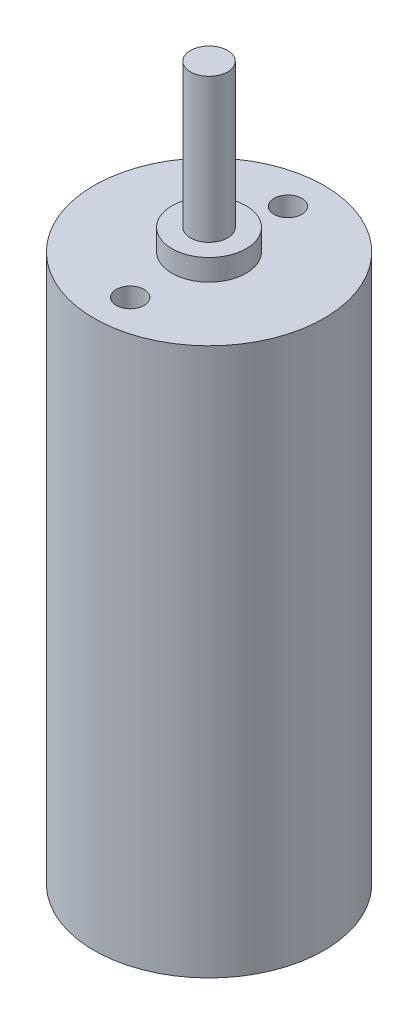
ISO-10303-21;
HEADER;
FILE_DESCRIPTION(('STEP AP214'),'2;1');
FILE_NAME('part.step','',(''),(''),'','','');
FILE_SCHEMA(('AUTOMOTIVE_DESIGN { 1 0 10303 214 1 1 1 1 }'));
ENDSEC;
DATA;
#1=APPLICATION_CONTEXT('core data for automotive mechanical design processes');
#2=APPLICATION_PROTOCOL_DEFINITION('international standard','automotive_design',2000,#1);
#3=PRODUCT_CONTEXT('',#1,'mechanical');
#4=PRODUCT('Part','Part','',(#3));
#5=PRODUCT_RELATED_PRODUCT_CATEGORY('part','',(#4));
#6=PRODUCT_DEFINITION_FORMATION('','',#4);
#7=PRODUCT_DEFINITION_CONTEXT('part definition',#1,'design');
#8=PRODUCT_DEFINITION('design','',#6,#7);
#9=PRODUCT_DEFINITION_SHAPE('','',#8);
#10=(LENGTH_UNIT() NAMED_UNIT(*) SI_UNIT(.MILLI.,.METRE.));
#11=(NAMED_UNIT(*) PLANE_ANGLE_UNIT() SI_UNIT($,.RADIAN.));
#12=(NAMED_UNIT(*) SI_UNIT($,.STERADIAN.) SOLID_ANGLE_UNIT());
#13=UNCERTAINTY_MEASURE_WITH_UNIT(LENGTH_MEASURE(1.E-05),#10,'distance_accuracy_value','');
#14=(GEOMETRIC_REPRESENTATION_CONTEXT(3) GLOBAL_UNCERTAINTY_ASSIGNED_CONTEXT((#13)) GLOBAL_UNIT_ASSIGNED_CONTEXT((#10,
#11,#12)) REPRESENTATION_CONTEXT('',''));
#15=CARTESIAN_POINT('',(0.,0.,0.));
#16=DIRECTION('',(0.,0.,1.));
#17=DIRECTION('',(1.,0.,0.));
#18=AXIS2_PLACEMENT_3D('',#15,#16,#17);
#19=CARTESIAN_POINT('',(0.,59.,0.));
#20=DIRECTION('',(0.,-1.,0.));
#21=DIRECTION('',(0.,0.,-1.));
#22=AXIS2_PLACEMENT_3D('',#19,#20,#21);
#23=CYLINDRICAL_SURFACE('',#22,12.4);
#24=CARTESIAN_POINT('',(0.,59.,0.));
#25=DIRECTION('',(0.,1.,0.));
#26=DIRECTION('',(0.,0.,1.));
#27=AXIS2_PLACEMENT_3D('',#24,#25,#26);
#28=CIRCLE('',#27,12.4);
#29=CARTESIAN_POINT('',(0.,59.,-12.4));
#30=VERTEX_POINT('',#29);
#31=EDGE_CURVE('E49',#30,#30,#28,.T.);
#32=CARTESIAN_POINT('',(0.,0.,0.));
#33=DIRECTION('',(0.,1.,0.));
#34=DIRECTION('',(0.,0.,1.));
#35=AXIS2_PLACEMENT_3D('',#32,#33,#34);
#36=CIRCLE('',#35,12.4);
#37=CARTESIAN_POINT('',(0.,0.,-12.4));
#38=VERTEX_POINT('',#37);
#39=EDGE_CURVE('E44',#38,#38,#36,.T.);
#40=CARTESIAN_POINT('',(0.,59.,-12.4));
#41=CARTESIAN_POINT('',(0.,58.3854166666667,-12.4));
#42=CARTESIAN_POINT('',(0.,57.7708333333333,-12.4));
#43=CARTESIAN_POINT('',(0.,56.5416666666667,-12.4));
#44=CARTESIAN_POINT('',(0.,55.9270833333333,-12.4));
#45=CARTESIAN_POINT('',(0.,54.6979166666667,-12.4));
#46=CARTESIAN_POINT('',(0.,54.0833333333333,-12.4));
#47=CARTESIAN_POINT('',(0.,52.8541666666667,-12.4));
#48=CARTESIAN_POINT('',(0.,52.2395833333333,-12.4));
#49=CARTESIAN_POINT('',(0.,51.0104166666667,-12.4));
#50=CARTESIAN_POINT('',(0.,50.3958333333333,-12.4));
#51=CARTESIAN_POINT('',(0.,49.1666666666667,-12.4));
#52=CARTESIAN_POINT('',(0.,48.5520833333333,-12.4));
#53=CARTESIAN_POINT('',(0.,47.3229166666667,-12.4));
#54=CARTESIAN_POINT('',(0.,46.7083333333333,-12.4));
#55=CARTESIAN_POINT('',(0.,45.4791666666667,-12.4));
#56=CARTESIAN_POINT('',(0.,44.8645833333333,-12.4));
#57=CARTESIAN_POINT('',(0.,43.6354166666667,-12.4));
#58=CARTESIAN_POINT('',(0.,43.0208333333333,-12.4));
#59=CARTESIAN_POINT('',(0.,41.7916666666667,-12.4));
#60=CARTESIAN_POINT('',(0.,41.1770833333333,-12.4));
#61=CARTESIAN_POINT('',(0.,39.9479166666667,-12.4));
#62=CARTESIAN_POINT('',(0.,39.3333333333333,-12.4));
#63=CARTESIAN_POINT('',(0.,38.1041666666667,-12.4));
#64=CARTESIAN_POINT('',(0.,37.4895833333333,-12.4));
#65=CARTESIAN_POINT('',(0.,36.2604166666667,-12.4));
#66=CARTESIAN_POINT('',(0.,35.6458333333333,-12.4));
#67=CARTESIAN_POINT('',(0.,34.4166666666667,-12.4));
#68=CARTESIAN_POINT('',(0.,33.8020833333333,-12.4));
#69=CARTESIAN_POINT('',(0.,32.5729166666667,-12.4));
#70=CARTESIAN_POINT('',(0.,31.9583333333333,-12.4));
#71=CARTESIAN_POINT('',(0.,30.7291666666667,-12.4));
#72=CARTESIAN_POINT('',(0.,30.1145833333333,-12.4));
#73=CARTESIAN_POINT('',(0.,28.8854166666667,-12.4));
#74=CARTESIAN_POINT('',(0.,28.2708333333333,-12.4));
#75=CARTESIAN_POINT('',(0.,27.0416666666667,-12.4));
#76=CARTESIAN_POINT('',(0.,26.4270833333333,-12.4));
#77=CARTESIAN_POINT('',(0.,25.1979166666667,-12.4));
#78=CARTESIAN_POINT('',(0.,24.5833333333333,-12.4));
#79=CARTESIAN_POINT('',(0.,23.3541666666667,-12.4));
#80=CARTESIAN_POINT('',(0.,22.7395833333333,-12.4));
#81=CARTESIAN_POINT('',(0.,21.5104166666667,-12.4));
#82=CARTESIAN_POINT('',(0.,20.8958333333333,-12.4));
#83=CARTESIAN_POINT('',(0.,19.6666666666667,-12.4));
#84=CARTESIAN_POINT('',(0.,19.0520833333333,-12.4));
#85=CARTESIAN_POINT('',(0.,17.8229166666667,-12.4));
#86=CARTESIAN_POINT('',(0.,17.2083333333333,-12.4));
#87=CARTESIAN_POINT('',(0.,15.9791666666667,-12.4));
#88=CARTESIAN_POINT('',(0.,15.3645833333333,-12.4));
#89=CARTESIAN_POINT('',(0.,14.1354166666667,-12.4));
#90=CARTESIAN_POINT('',(0.,13.5208333333333,-12.4));
#91=CARTESIAN_POINT('',(0.,12.2916666666667,-12.4));
#92=CARTESIAN_POINT('',(0.,11.6770833333333,-12.4));
#93=CARTESIAN_POINT('',(0.,10.4479166666667,-12.4));
#94=CARTESIAN_POINT('',(0.,9.83333333333333,-12.4));
#95=CARTESIAN_POINT('',(0.,8.60416666666666,-12.4));
#96=CARTESIAN_POINT('',(0.,7.98958333333333,-12.4));
#97=CARTESIAN_POINT('',(0.,6.76041666666667,-12.4));
#98=CARTESIAN_POINT('',(0.,6.14583333333333,-12.4));
#99=CARTESIAN_POINT('',(0.,4.91666666666667,-12.4));
#100=CARTESIAN_POINT('',(0.,4.30208333333334,-12.4));
#101=CARTESIAN_POINT('',(0.,3.07291666666667,-12.4));
#102=CARTESIAN_POINT('',(0.,2.45833333333333,-12.4));
#103=CARTESIAN_POINT('',(0.,1.22916666666667,-12.4));
#104=CARTESIAN_POINT('',(0.,0.614583333333332,-12.4));
#105=CARTESIAN_POINT('',(0.,0.,-12.4));
#106=B_SPLINE_CURVE_WITH_KNOTS('',3,(#40,#41,#42,#43,#44,#45,#46,#47,#48,#49,#50,#51,#52,#53,
#54,#55,#56,#57,#58,#59,#60,#61,#62,#63,#64,#65,#66,#67,#68,#69,#70,#71,#72,#73,#74,#75,#76,#77,
#78,#79,#80,#81,#82,#83,#84,#85,#86,#87,#88,#89,#90,#91,#92,#93,#94,#95,#96,#97,#98,#99,#100,
#101,#102,#103,#104,#105),.UNSPECIFIED.,.F.,.F.,(4,2,2,2,2,2,2,2,2,2,2,2,2,2,2,2,2,2,2,2,2,2,2,
2,2,2,2,2,2,2,2,2,4),(0.,1.84375,3.6875,5.53124999999999,7.37499999999999,9.21875,11.0625,
12.90625,14.75,16.59375,18.4375,20.28125,22.125,23.96875,25.8125,27.65625,29.5,31.34375,33.1875,
35.03125,36.875,38.71875,40.5625,42.40625,44.25,46.09375,47.9375,49.78125,51.625,53.46875,
55.3125,57.15625,59.),.UNSPECIFIED.);
#107=EDGE_CURVE('BSEAM41',#30,#38,#106,.T.);
#108=ORIENTED_EDGE('',*,*,#31,.F.);
#109=ORIENTED_EDGE('',*,*,#39,.T.);
#110=ORIENTED_EDGE('',*,*,#107,.T.);
#111=ORIENTED_EDGE('',*,*,#107,.F.);
#112=EDGE_LOOP('',(#108,#110,#109,#111));
#113=FACE_BOUND('',#112,.T.);
#114=ADVANCED_FACE('F41',(#113),#23,.T.);
#115=CARTESIAN_POINT('',(0.,59.,0.));
#116=DIRECTION('',(0.,1.,0.));
#117=DIRECTION('',(0.,0.,1.));
#118=AXIS2_PLACEMENT_3D('',#115,#116,#117);
#119=PLANE('',#118);
#120=CARTESIAN_POINT('',(0.,59.,0.));
#121=DIRECTION('',(0.,1.,0.));
#122=DIRECTION('',(0.,0.,1.));
#123=AXIS2_PLACEMENT_3D('',#120,#121,#122);
#124=CIRCLE('',#123,4.);
#125=CARTESIAN_POINT('',(0.,59.,4.));
#126=VERTEX_POINT('',#125);
#127=EDGE_CURVE('E63',#126,#126,#124,.T.);
#128=ORIENTED_EDGE('',*,*,#127,.F.);
#129=EDGE_LOOP('',(#128));
#130=FACE_BOUND('',#129,.T.);
#131=CARTESIAN_POINT('',(0.,59.,-8.5));
#132=DIRECTION('',(0.,1.,0.));
#133=DIRECTION('',(0.,0.,1.));
#134=AXIS2_PLACEMENT_3D('',#131,#132,#133);
#135=CIRCLE('',#134,1.5);
#136=CARTESIAN_POINT('',(0.,59.,-7.));
#137=VERTEX_POINT('',#136);
#138=EDGE_CURVE('E71',#137,#137,#135,.T.);
#139=ORIENTED_EDGE('',*,*,#138,.F.);
#140=EDGE_LOOP('',(#139));
#141=FACE_BOUND('',#140,.T.);
#142=CARTESIAN_POINT('',(0.,59.,8.5));
#143=DIRECTION('',(0.,1.,0.));
#144=DIRECTION('',(0.,0.,1.));
#145=AXIS2_PLACEMENT_3D('',#142,#143,#144);
#146=CIRCLE('',#145,1.5);
#147=CARTESIAN_POINT('',(0.,59.,10.));
#148=VERTEX_POINT('',#147);
#149=EDGE_CURVE('E75',#148,#148,#146,.T.);
#150=ORIENTED_EDGE('',*,*,#149,.F.);
#151=EDGE_LOOP('',(#150));
#152=FACE_BOUND('',#151,.T.);
#153=ORIENTED_EDGE('',*,*,#31,.T.);
#154=EDGE_LOOP('',(#153));
#155=FACE_BOUND('',#154,.T.);
#156=ADVANCED_FACE('F92',(#130,#141,#152,#155),#119,.T.);
#157=CARTESIAN_POINT('',(0.,0.,0.));
#158=DIRECTION('',(0.,1.,0.));
#159=DIRECTION('',(0.,0.,1.));
#160=AXIS2_PLACEMENT_3D('',#157,#158,#159);
#161=PLANE('',#160);
#162=ORIENTED_EDGE('',*,*,#39,.F.);
#163=EDGE_LOOP('',(#162));
#164=FACE_BOUND('',#163,.T.);
#165=ADVANCED_FACE('F88',(#164),#161,.F.);
#166=CARTESIAN_POINT('',(0.,55.5202,8.5));
#167=DIRECTION('',(0.,1.,0.));
#168=DIRECTION('',(0.,0.,1.));
#169=AXIS2_PLACEMENT_3D('',#166,#167,#168);
#170=CYLINDRICAL_SURFACE('',#169,1.5);
#171=CARTESIAN_POINT('',(0.,55.5202,8.5));
#172=DIRECTION('',(0.,1.,0.));
#173=DIRECTION('',(0.,0.,1.));
#174=AXIS2_PLACEMENT_3D('',#171,#172,#173);
#175=CIRCLE('',#174,1.5);
#176=CARTESIAN_POINT('',(0.,55.5202,10.));
#177=VERTEX_POINT('',#176);
#178=EDGE_CURVE('E62',#177,#177,#175,.T.);
#179=ORIENTED_EDGE('',*,*,#178,.F.);
#180=EDGE_LOOP('',(#179));
#181=FACE_BOUND('',#180,.T.);
#182=ORIENTED_EDGE('',*,*,#149,.T.);
#183=EDGE_LOOP('',(#182));
#184=FACE_BOUND('',#183,.T.);
#185=ADVANCED_FACE('F85',(#181,#184),#170,.F.);
#186=CARTESIAN_POINT('',(0.,55.5202,8.5));
#187=DIRECTION('',(0.,1.,0.));
#188=DIRECTION('',(0.,0.,1.));
#189=AXIS2_PLACEMENT_3D('',#186,#187,#188);
#190=PLANE('',#189);
#191=ORIENTED_EDGE('',*,*,#178,.T.);
#192=EDGE_LOOP('',(#191));
#193=FACE_BOUND('',#192,.T.);
#194=ADVANCED_FACE('F83',(#193),#190,.T.);
#195=CARTESIAN_POINT('',(0.,55.5202,-8.5));
#196=DIRECTION('',(0.,1.,0.));
#197=DIRECTION('',(0.,0.,1.));
#198=AXIS2_PLACEMENT_3D('',#195,#196,#197);
#199=CYLINDRICAL_SURFACE('',#198,1.5);
#200=CARTESIAN_POINT('',(0.,55.5202,-8.5));
#201=DIRECTION('',(0.,1.,0.));
#202=DIRECTION('',(0.,0.,1.));
#203=AXIS2_PLACEMENT_3D('',#200,#201,#202);
#204=CIRCLE('',#203,1.5);
#205=CARTESIAN_POINT('',(0.,55.5202,-7.));
#206=VERTEX_POINT('',#205);
#207=EDGE_CURVE('E67',#206,#206,#204,.T.);
#208=ORIENTED_EDGE('',*,*,#207,.F.);
#209=EDGE_LOOP('',(#208));
#210=FACE_BOUND('',#209,.T.);
#211=ORIENTED_EDGE('',*,*,#138,.T.);
#212=EDGE_LOOP('',(#211));
#213=FACE_BOUND('',#212,.T.);
#214=ADVANCED_FACE('F110',(#210,#213),#199,.F.);
#215=CARTESIAN_POINT('',(0.,55.5202,-8.5));
#216=DIRECTION('',(0.,1.,0.));
#217=DIRECTION('',(0.,0.,1.));
#218=AXIS2_PLACEMENT_3D('',#215,#216,#217);
#219=PLANE('',#218);
#220=ORIENTED_EDGE('',*,*,#207,.T.);
#221=EDGE_LOOP('',(#220));
#222=FACE_BOUND('',#221,.T.);
#223=ADVANCED_FACE('F114',(#222),#219,.T.);
#224=CARTESIAN_POINT('',(0.,61.3,0.));
#225=DIRECTION('',(0.,-1.,0.));
#226=DIRECTION('',(0.,0.,-1.));
#227=AXIS2_PLACEMENT_3D('',#224,#225,#226);
#228=CYLINDRICAL_SURFACE('',#227,4.);
#229=CARTESIAN_POINT('',(0.,61.3,0.));
#230=DIRECTION('',(0.,1.,0.));
#231=DIRECTION('',(0.,0.,1.));
#232=AXIS2_PLACEMENT_3D('',#229,#230,#231);
#233=CIRCLE('',#232,4.);
#234=CARTESIAN_POINT('',(0.,61.3,4.));
#235=VERTEX_POINT('',#234);
#236=EDGE_CURVE('E58',#235,#235,#233,.T.);
#237=ORIENTED_EDGE('',*,*,#236,.F.);
#238=EDGE_LOOP('',(#237));
#239=FACE_BOUND('',#238,.T.);
#240=ORIENTED_EDGE('',*,*,#127,.T.);
#241=EDGE_LOOP('',(#240));
#242=FACE_BOUND('',#241,.T.);
#243=ADVANCED_FACE('F118',(#239,#242),#228,.T.);
#244=CARTESIAN_POINT('',(0.,61.3,0.));
#245=DIRECTION('',(0.,1.,0.));
#246=DIRECTION('',(0.,0.,1.));
#247=AXIS2_PLACEMENT_3D('',#244,#245,#246);
#248=PLANE('',#247);
#249=CARTESIAN_POINT('',(0.,61.3,0.));
#250=DIRECTION('',(0.,1.,0.));
#251=DIRECTION('',(0.,0.,1.));
#252=AXIS2_PLACEMENT_3D('',#249,#250,#251);
#253=CIRCLE('',#252,2.);
#254=CARTESIAN_POINT('',(0.,61.3,2.));
#255=VERTEX_POINT('',#254);
#256=EDGE_CURVE('E10',#255,#255,#253,.T.);
#257=ORIENTED_EDGE('',*,*,#256,.F.);
#258=EDGE_LOOP('',(#257));
#259=FACE_BOUND('',#258,.T.);
#260=ORIENTED_EDGE('',*,*,#236,.T.);
#261=EDGE_LOOP('',(#260));
#262=FACE_BOUND('',#261,.T.);
#263=ADVANCED_FACE('F122',(#259,#262),#248,.T.);
#264=CARTESIAN_POINT('',(0.,76.8,0.));
#265=DIRECTION('',(0.,-1.,0.));
#266=DIRECTION('',(0.,0.,-1.));
#267=AXIS2_PLACEMENT_3D('',#264,#265,#266);
#268=CYLINDRICAL_SURFACE('',#267,2.);
#269=CARTESIAN_POINT('',(0.,76.8,0.));
#270=DIRECTION('',(0.,1.,0.));
#271=DIRECTION('',(0.,0.,1.));
#272=AXIS2_PLACEMENT_3D('',#269,#270,#271);
#273=CIRCLE('',#272,2.);
#274=CARTESIAN_POINT('',(0.,76.8,2.));
#275=VERTEX_POINT('',#274);
#276=EDGE_CURVE('E57',#275,#275,#273,.T.);
#277=ORIENTED_EDGE('',*,*,#276,.F.);
#278=EDGE_LOOP('',(#277));
#279=FACE_BOUND('',#278,.T.);
#280=ORIENTED_EDGE('',*,*,#256,.T.);
#281=EDGE_LOOP('',(#280));
#282=FACE_BOUND('',#281,.T.);
#283=ADVANCED_FACE('F126',(#279,#282),#268,.T.);
#284=CARTESIAN_POINT('',(0.,76.8,0.));
#285=DIRECTION('',(0.,1.,0.));
#286=DIRECTION('',(0.,0.,1.));
#287=AXIS2_PLACEMENT_3D('',#284,#285,#286);
#288=PLANE('',#287);
#289=ORIENTED_EDGE('',*,*,#276,.T.);
#290=EDGE_LOOP('',(#289));
#291=FACE_BOUND('',#290,.T.);
#292=ADVANCED_FACE('F130',(#291),#288,.T.);
#293=CLOSED_SHELL('',(#114,#156,#165,#185,#194,#214,#223,#243,#263,#283,#292));
#294=MANIFOLD_SOLID_BREP('B2',#293);
#295=ADVANCED_BREP_SHAPE_REPRESENTATION('',(#18,#294),#14);
#296=SHAPE_DEFINITION_REPRESENTATION(#9,#295);
ENDSEC;
END-ISO-10303-21;
